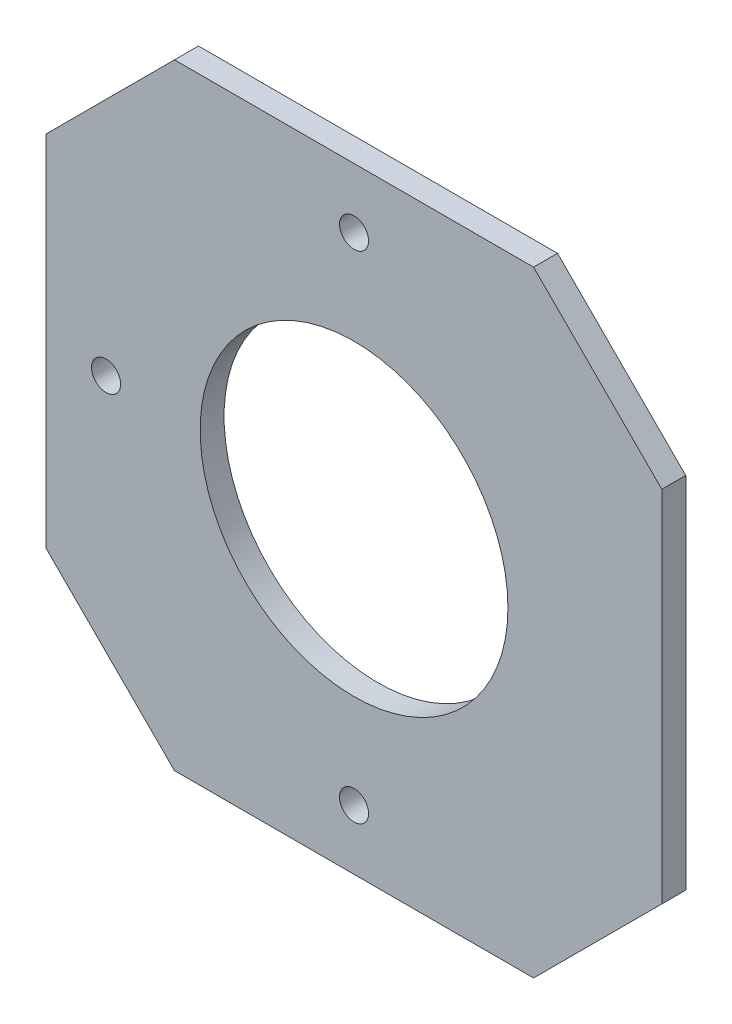
ISO-10303-21;
HEADER;
FILE_DESCRIPTION(('STEP AP214'),'2;1');
FILE_NAME('part.step','',(''),(''),'','','');
FILE_SCHEMA(('AUTOMOTIVE_DESIGN { 1 0 10303 214 1 1 1 1 }'));
ENDSEC;
DATA;
#1=APPLICATION_CONTEXT('core data for automotive mechanical design processes');
#2=APPLICATION_PROTOCOL_DEFINITION('international standard','automotive_design',2000,#1);
#3=PRODUCT_CONTEXT('',#1,'mechanical');
#4=PRODUCT('Part','Part','',(#3));
#5=PRODUCT_RELATED_PRODUCT_CATEGORY('part','',(#4));
#6=PRODUCT_DEFINITION_FORMATION('','',#4);
#7=PRODUCT_DEFINITION_CONTEXT('part definition',#1,'design');
#8=PRODUCT_DEFINITION('design','',#6,#7);
#9=PRODUCT_DEFINITION_SHAPE('','',#8);
#10=(LENGTH_UNIT() NAMED_UNIT(*) SI_UNIT(.MILLI.,.METRE.));
#11=(NAMED_UNIT(*) PLANE_ANGLE_UNIT() SI_UNIT($,.RADIAN.));
#12=(NAMED_UNIT(*) SI_UNIT($,.STERADIAN.) SOLID_ANGLE_UNIT());
#13=UNCERTAINTY_MEASURE_WITH_UNIT(LENGTH_MEASURE(1.E-05),#10,'distance_accuracy_value','');
#14=(GEOMETRIC_REPRESENTATION_CONTEXT(3) GLOBAL_UNCERTAINTY_ASSIGNED_CONTEXT((#13)) GLOBAL_UNIT_ASSIGNED_CONTEXT((#10,
#11,#12)) REPRESENTATION_CONTEXT('',''));
#15=CARTESIAN_POINT('',(0.,0.,0.));
#16=DIRECTION('',(0.,0.,1.));
#17=DIRECTION('',(1.,0.,0.));
#18=AXIS2_PLACEMENT_3D('',#15,#16,#17);
#19=CARTESIAN_POINT('',(0.,0.,2.8));
#20=DIRECTION('',(0.,0.,1.));
#21=DIRECTION('',(1.,0.,0.));
#22=AXIS2_PLACEMENT_3D('',#19,#20,#21);
#23=PLANE('',#22);
#24=CARTESIAN_POINT('',(0.,-29.,2.8));
#25=DIRECTION('',(0.,0.,1.));
#26=DIRECTION('',(1.,0.,0.));
#27=AXIS2_PLACEMENT_3D('',#24,#25,#26);
#28=CIRCLE('',#27,1.7);
#29=CARTESIAN_POINT('',(1.7,-29.,2.8));
#30=VERTEX_POINT('',#29);
#31=EDGE_CURVE('E196',#30,#30,#28,.T.);
#32=ORIENTED_EDGE('',*,*,#31,.F.);
#33=EDGE_LOOP('',(#32));
#34=FACE_BOUND('',#33,.T.);
#35=CARTESIAN_POINT('',(0.,0.,2.8));
#36=DIRECTION('',(0.,0.,1.));
#37=DIRECTION('',(1.,0.,0.));
#38=AXIS2_PLACEMENT_3D('',#35,#36,#37);
#39=CIRCLE('',#38,18.);
#40=CARTESIAN_POINT('',(18.,0.,2.8));
#41=VERTEX_POINT('',#40);
#42=EDGE_CURVE('E142',#41,#41,#39,.T.);
#43=ORIENTED_EDGE('',*,*,#42,.F.);
#44=EDGE_LOOP('',(#43));
#45=FACE_BOUND('',#44,.T.);
#46=DIRECTION('',(0.707106781186544,-0.707106781186551,0.));
#47=VECTOR('',#46,1.);
#48=CARTESIAN_POINT('',(-35.9999999999999,-21.,2.8));
#49=LINE('',#48,#47);
#50=CARTESIAN_POINT('',(-35.9999999999999,-21.,2.8));
#51=VERTEX_POINT('',#50);
#52=CARTESIAN_POINT('',(-21.,-36.,2.8));
#53=VERTEX_POINT('',#52);
#54=EDGE_CURVE('E153',#51,#53,#49,.T.);
#55=ORIENTED_EDGE('',*,*,#54,.T.);
#56=DIRECTION('',(1.,0.,0.));
#57=VECTOR('',#56,1.);
#58=CARTESIAN_POINT('',(-21.,-36.,2.8));
#59=LINE('',#58,#57);
#60=CARTESIAN_POINT('',(21.,-36.,2.8));
#61=VERTEX_POINT('',#60);
#62=EDGE_CURVE('E101',#53,#61,#59,.T.);
#63=ORIENTED_EDGE('',*,*,#62,.T.);
#64=DIRECTION('',(0.707106781186546,0.707106781186548,0.));
#65=VECTOR('',#64,1.);
#66=CARTESIAN_POINT('',(21.,-36.,2.8));
#67=LINE('',#66,#65);
#68=CARTESIAN_POINT('',(36.,-21.,2.8));
#69=VERTEX_POINT('',#68);
#70=EDGE_CURVE('E168',#61,#69,#67,.T.);
#71=ORIENTED_EDGE('',*,*,#70,.T.);
#72=DIRECTION('',(0.,1.,0.));
#73=VECTOR('',#72,1.);
#74=CARTESIAN_POINT('',(36.,-21.,2.8));
#75=LINE('',#74,#73);
#76=CARTESIAN_POINT('',(36.,21.,2.8));
#77=VERTEX_POINT('',#76);
#78=EDGE_CURVE('E181',#69,#77,#75,.T.);
#79=ORIENTED_EDGE('',*,*,#78,.T.);
#80=DIRECTION('',(-0.707106781186549,0.707106781186546,0.));
#81=VECTOR('',#80,1.);
#82=CARTESIAN_POINT('',(36.,21.,2.8));
#83=LINE('',#82,#81);
#84=CARTESIAN_POINT('',(21.,35.9999999999999,2.8));
#85=VERTEX_POINT('',#84);
#86=EDGE_CURVE('E120',#77,#85,#83,.T.);
#87=ORIENTED_EDGE('',*,*,#86,.T.);
#88=DIRECTION('',(-1.,0.,0.));
#89=VECTOR('',#88,1.);
#90=CARTESIAN_POINT('',(21.,35.9999999999999,2.8));
#91=LINE('',#90,#89);
#92=CARTESIAN_POINT('',(-21.,35.9999999999999,2.8));
#93=VERTEX_POINT('',#92);
#94=EDGE_CURVE('E114',#85,#93,#91,.T.);
#95=ORIENTED_EDGE('',*,*,#94,.T.);
#96=DIRECTION('',(-0.707106781186546,-0.707106781186549,0.));
#97=VECTOR('',#96,1.);
#98=CARTESIAN_POINT('',(-21.,35.9999999999999,2.8));
#99=LINE('',#98,#97);
#100=CARTESIAN_POINT('',(-35.9999999999999,21.,2.8));
#101=VERTEX_POINT('',#100);
#102=EDGE_CURVE('E118',#93,#101,#99,.T.);
#103=ORIENTED_EDGE('',*,*,#102,.T.);
#104=DIRECTION('',(0.,-1.,0.));
#105=VECTOR('',#104,1.);
#106=CARTESIAN_POINT('',(-35.9999999999999,21.,2.8));
#107=LINE('',#106,#105);
#108=EDGE_CURVE('E58',#101,#51,#107,.T.);
#109=ORIENTED_EDGE('',*,*,#108,.T.);
#110=EDGE_LOOP('',(#55,#63,#71,#79,#87,#95,#103,#109));
#111=FACE_BOUND('',#110,.T.);
#112=CARTESIAN_POINT('',(0.,29.,2.8));
#113=DIRECTION('',(0.,0.,1.));
#114=DIRECTION('',(1.,0.,0.));
#115=AXIS2_PLACEMENT_3D('',#112,#113,#114);
#116=CIRCLE('',#115,1.7);
#117=CARTESIAN_POINT('',(1.7,29.,2.8));
#118=VERTEX_POINT('',#117);
#119=EDGE_CURVE('E190',#118,#118,#116,.T.);
#120=ORIENTED_EDGE('',*,*,#119,.F.);
#121=EDGE_LOOP('',(#120));
#122=FACE_BOUND('',#121,.T.);
#123=CARTESIAN_POINT('',(-29.,0.,2.8));
#124=DIRECTION('',(0.,0.,1.));
#125=DIRECTION('',(1.,0.,0.));
#126=AXIS2_PLACEMENT_3D('',#123,#124,#125);
#127=CIRCLE('',#126,1.7);
#128=CARTESIAN_POINT('',(-27.3,0.,2.8));
#129=VERTEX_POINT('',#128);
#130=EDGE_CURVE('E202',#129,#129,#127,.T.);
#131=ORIENTED_EDGE('',*,*,#130,.F.);
#132=EDGE_LOOP('',(#131));
#133=FACE_BOUND('',#132,.T.);
#134=ADVANCED_FACE('F41',(#34,#45,#111,#122,#133),#23,.T.);
#135=CARTESIAN_POINT('',(0.,0.,0.));
#136=DIRECTION('',(0.,0.,1.));
#137=DIRECTION('',(1.,0.,0.));
#138=AXIS2_PLACEMENT_3D('',#135,#136,#137);
#139=PLANE('',#138);
#140=DIRECTION('',(0.707106781186544,-0.707106781186551,0.));
#141=VECTOR('',#140,1.);
#142=CARTESIAN_POINT('',(-35.9999999999999,-21.,0.));
#143=LINE('',#142,#141);
#144=CARTESIAN_POINT('',(-35.9999999999999,-21.,0.));
#145=VERTEX_POINT('',#144);
#146=CARTESIAN_POINT('',(-21.,-36.,0.));
#147=VERTEX_POINT('',#146);
#148=EDGE_CURVE('E138',#145,#147,#143,.T.);
#149=ORIENTED_EDGE('',*,*,#148,.F.);
#150=DIRECTION('',(0.,-1.,0.));
#151=VECTOR('',#150,1.);
#152=CARTESIAN_POINT('',(-35.9999999999999,21.,0.));
#153=LINE('',#152,#151);
#154=CARTESIAN_POINT('',(-35.9999999999999,21.,0.));
#155=VERTEX_POINT('',#154);
#156=EDGE_CURVE('E93',#155,#145,#153,.T.);
#157=ORIENTED_EDGE('',*,*,#156,.F.);
#158=DIRECTION('',(-0.707106781186546,-0.707106781186549,0.));
#159=VECTOR('',#158,1.);
#160=CARTESIAN_POINT('',(-21.,35.9999999999999,0.));
#161=LINE('',#160,#159);
#162=CARTESIAN_POINT('',(-21.,35.9999999999999,0.));
#163=VERTEX_POINT('',#162);
#164=EDGE_CURVE('E87',#163,#155,#161,.T.);
#165=ORIENTED_EDGE('',*,*,#164,.F.);
#166=DIRECTION('',(-1.,0.,0.));
#167=VECTOR('',#166,1.);
#168=CARTESIAN_POINT('',(21.,35.9999999999999,0.));
#169=LINE('',#168,#167);
#170=CARTESIAN_POINT('',(21.,35.9999999999999,0.));
#171=VERTEX_POINT('',#170);
#172=EDGE_CURVE('E128',#171,#163,#169,.T.);
#173=ORIENTED_EDGE('',*,*,#172,.F.);
#174=DIRECTION('',(-0.707106781186549,0.707106781186546,0.));
#175=VECTOR('',#174,1.);
#176=CARTESIAN_POINT('',(36.,21.,0.));
#177=LINE('',#176,#175);
#178=CARTESIAN_POINT('',(36.,21.,0.));
#179=VERTEX_POINT('',#178);
#180=EDGE_CURVE('E148',#179,#171,#177,.T.);
#181=ORIENTED_EDGE('',*,*,#180,.F.);
#182=DIRECTION('',(0.,1.,0.));
#183=VECTOR('',#182,1.);
#184=CARTESIAN_POINT('',(36.,-21.,0.));
#185=LINE('',#184,#183);
#186=CARTESIAN_POINT('',(36.,-21.,0.));
#187=VERTEX_POINT('',#186);
#188=EDGE_CURVE('E146',#187,#179,#185,.T.);
#189=ORIENTED_EDGE('',*,*,#188,.F.);
#190=DIRECTION('',(0.707106781186546,0.707106781186548,0.));
#191=VECTOR('',#190,1.);
#192=CARTESIAN_POINT('',(21.,-36.,0.));
#193=LINE('',#192,#191);
#194=CARTESIAN_POINT('',(21.,-36.,0.));
#195=VERTEX_POINT('',#194);
#196=EDGE_CURVE('E144',#195,#187,#193,.T.);
#197=ORIENTED_EDGE('',*,*,#196,.F.);
#198=DIRECTION('',(1.,0.,0.));
#199=VECTOR('',#198,1.);
#200=CARTESIAN_POINT('',(-21.,-36.,0.));
#201=LINE('',#200,#199);
#202=EDGE_CURVE('E141',#147,#195,#201,.T.);
#203=ORIENTED_EDGE('',*,*,#202,.F.);
#204=EDGE_LOOP('',(#149,#157,#165,#173,#181,#189,#197,#203));
#205=FACE_BOUND('',#204,.T.);
#206=CARTESIAN_POINT('',(0.,0.,0.));
#207=DIRECTION('',(0.,0.,1.));
#208=DIRECTION('',(1.,0.,0.));
#209=AXIS2_PLACEMENT_3D('',#206,#207,#208);
#210=CIRCLE('',#209,18.);
#211=CARTESIAN_POINT('',(18.,0.,0.));
#212=VERTEX_POINT('',#211);
#213=EDGE_CURVE('E187',#212,#212,#210,.T.);
#214=ORIENTED_EDGE('',*,*,#213,.T.);
#215=EDGE_LOOP('',(#214));
#216=FACE_BOUND('',#215,.T.);
#217=CARTESIAN_POINT('',(0.,29.,0.));
#218=DIRECTION('',(0.,0.,1.));
#219=DIRECTION('',(1.,0.,0.));
#220=AXIS2_PLACEMENT_3D('',#217,#218,#219);
#221=CIRCLE('',#220,1.7);
#222=CARTESIAN_POINT('',(1.7,29.,0.));
#223=VERTEX_POINT('',#222);
#224=EDGE_CURVE('E193',#223,#223,#221,.T.);
#225=ORIENTED_EDGE('',*,*,#224,.T.);
#226=EDGE_LOOP('',(#225));
#227=FACE_BOUND('',#226,.T.);
#228=CARTESIAN_POINT('',(0.,-29.,0.));
#229=DIRECTION('',(0.,0.,1.));
#230=DIRECTION('',(1.,0.,0.));
#231=AXIS2_PLACEMENT_3D('',#228,#229,#230);
#232=CIRCLE('',#231,1.7);
#233=CARTESIAN_POINT('',(1.7,-29.,0.));
#234=VERTEX_POINT('',#233);
#235=EDGE_CURVE('E199',#234,#234,#232,.T.);
#236=ORIENTED_EDGE('',*,*,#235,.T.);
#237=EDGE_LOOP('',(#236));
#238=FACE_BOUND('',#237,.T.);
#239=CARTESIAN_POINT('',(-29.,0.,0.));
#240=DIRECTION('',(0.,0.,1.));
#241=DIRECTION('',(1.,0.,0.));
#242=AXIS2_PLACEMENT_3D('',#239,#240,#241);
#243=CIRCLE('',#242,1.7);
#244=CARTESIAN_POINT('',(-27.3,0.,0.));
#245=VERTEX_POINT('',#244);
#246=EDGE_CURVE('E205',#245,#245,#243,.T.);
#247=ORIENTED_EDGE('',*,*,#246,.T.);
#248=EDGE_LOOP('',(#247));
#249=FACE_BOUND('',#248,.T.);
#250=ADVANCED_FACE('F172',(#205,#216,#227,#238,#249),#139,.F.);
#251=CARTESIAN_POINT('',(-35.9999999999999,-21.,2.8));
#252=DIRECTION('',(0.707106781186551,0.707106781186544,0.));
#253=DIRECTION('',(-0.707106781186544,0.707106781186551,0.));
#254=AXIS2_PLACEMENT_3D('',#251,#252,#253);
#255=PLANE('',#254);
#256=ORIENTED_EDGE('',*,*,#148,.T.);
#257=DIRECTION('',(0.,0.,-1.));
#258=VECTOR('',#257,1.);
#259=CARTESIAN_POINT('',(-21.,-36.,2.8));
#260=LINE('',#259,#258);
#261=EDGE_CURVE('E11',#53,#147,#260,.T.);
#262=ORIENTED_EDGE('',*,*,#261,.F.);
#263=ORIENTED_EDGE('',*,*,#54,.F.);
#264=DIRECTION('',(0.,0.,-1.));
#265=VECTOR('',#264,1.);
#266=CARTESIAN_POINT('',(-35.9999999999999,-21.,2.8));
#267=LINE('',#266,#265);
#268=EDGE_CURVE('E134',#51,#145,#267,.T.);
#269=ORIENTED_EDGE('',*,*,#268,.T.);
#270=EDGE_LOOP('',(#256,#262,#263,#269));
#271=FACE_BOUND('',#270,.T.);
#272=ADVANCED_FACE('F43',(#271),#255,.F.);
#273=CARTESIAN_POINT('',(-21.,-36.,2.8));
#274=DIRECTION('',(0.,1.,0.));
#275=DIRECTION('',(0.,0.,1.));
#276=AXIS2_PLACEMENT_3D('',#273,#274,#275);
#277=PLANE('',#276);
#278=ORIENTED_EDGE('',*,*,#202,.T.);
#279=DIRECTION('',(0.,0.,-1.));
#280=VECTOR('',#279,1.);
#281=CARTESIAN_POINT('',(21.,-36.,2.8));
#282=LINE('',#281,#280);
#283=EDGE_CURVE('E50',#61,#195,#282,.T.);
#284=ORIENTED_EDGE('',*,*,#283,.F.);
#285=ORIENTED_EDGE('',*,*,#62,.F.);
#286=ORIENTED_EDGE('',*,*,#261,.T.);
#287=EDGE_LOOP('',(#278,#284,#285,#286));
#288=FACE_BOUND('',#287,.T.);
#289=ADVANCED_FACE('F239',(#288),#277,.F.);
#290=CARTESIAN_POINT('',(21.,-36.,2.8));
#291=DIRECTION('',(-0.707106781186549,0.707106781186546,0.));
#292=DIRECTION('',(-0.707106781186546,-0.707106781186549,0.));
#293=AXIS2_PLACEMENT_3D('',#290,#291,#292);
#294=PLANE('',#293);
#295=ORIENTED_EDGE('',*,*,#196,.T.);
#296=DIRECTION('',(0.,0.,-1.));
#297=VECTOR('',#296,1.);
#298=CARTESIAN_POINT('',(36.,-21.,2.8));
#299=LINE('',#298,#297);
#300=EDGE_CURVE('E160',#69,#187,#299,.T.);
#301=ORIENTED_EDGE('',*,*,#300,.F.);
#302=ORIENTED_EDGE('',*,*,#70,.F.);
#303=ORIENTED_EDGE('',*,*,#283,.T.);
#304=EDGE_LOOP('',(#295,#301,#302,#303));
#305=FACE_BOUND('',#304,.T.);
#306=ADVANCED_FACE('F166',(#305),#294,.F.);
#307=CARTESIAN_POINT('',(36.,-21.,2.8));
#308=DIRECTION('',(-1.,0.,0.));
#309=DIRECTION('',(0.,0.,1.));
#310=AXIS2_PLACEMENT_3D('',#307,#308,#309);
#311=PLANE('',#310);
#312=ORIENTED_EDGE('',*,*,#188,.T.);
#313=DIRECTION('',(0.,0.,-1.));
#314=VECTOR('',#313,1.);
#315=CARTESIAN_POINT('',(36.,21.,2.8));
#316=LINE('',#315,#314);
#317=EDGE_CURVE('E157',#77,#179,#316,.T.);
#318=ORIENTED_EDGE('',*,*,#317,.F.);
#319=ORIENTED_EDGE('',*,*,#78,.F.);
#320=ORIENTED_EDGE('',*,*,#300,.T.);
#321=EDGE_LOOP('',(#312,#318,#319,#320));
#322=FACE_BOUND('',#321,.T.);
#323=ADVANCED_FACE('F177',(#322),#311,.F.);
#324=CARTESIAN_POINT('',(36.,21.,2.8));
#325=DIRECTION('',(-0.707106781186546,-0.707106781186549,0.));
#326=DIRECTION('',(0.707106781186549,-0.707106781186546,0.));
#327=AXIS2_PLACEMENT_3D('',#324,#325,#326);
#328=PLANE('',#327);
#329=ORIENTED_EDGE('',*,*,#180,.T.);
#330=DIRECTION('',(0.,0.,-1.));
#331=VECTOR('',#330,1.);
#332=CARTESIAN_POINT('',(21.,35.9999999999999,2.8));
#333=LINE('',#332,#331);
#334=EDGE_CURVE('E129',#85,#171,#333,.T.);
#335=ORIENTED_EDGE('',*,*,#334,.F.);
#336=ORIENTED_EDGE('',*,*,#86,.F.);
#337=ORIENTED_EDGE('',*,*,#317,.T.);
#338=EDGE_LOOP('',(#329,#335,#336,#337));
#339=FACE_BOUND('',#338,.T.);
#340=ADVANCED_FACE('F180',(#339),#328,.F.);
#341=CARTESIAN_POINT('',(21.,35.9999999999999,2.8));
#342=DIRECTION('',(0.,-1.,0.));
#343=DIRECTION('',(0.,0.,-1.));
#344=AXIS2_PLACEMENT_3D('',#341,#342,#343);
#345=PLANE('',#344);
#346=ORIENTED_EDGE('',*,*,#172,.T.);
#347=DIRECTION('',(0.,0.,-1.));
#348=VECTOR('',#347,1.);
#349=CARTESIAN_POINT('',(-21.,35.9999999999999,2.8));
#350=LINE('',#349,#348);
#351=EDGE_CURVE('E125',#93,#163,#350,.T.);
#352=ORIENTED_EDGE('',*,*,#351,.F.);
#353=ORIENTED_EDGE('',*,*,#94,.F.);
#354=ORIENTED_EDGE('',*,*,#334,.T.);
#355=EDGE_LOOP('',(#346,#352,#353,#354));
#356=FACE_BOUND('',#355,.T.);
#357=ADVANCED_FACE('F126',(#356),#345,.F.);
#358=CARTESIAN_POINT('',(-21.,35.9999999999999,2.8));
#359=DIRECTION('',(0.707106781186549,-0.707106781186546,0.));
#360=DIRECTION('',(0.707106781186546,0.707106781186549,0.));
#361=AXIS2_PLACEMENT_3D('',#358,#359,#360);
#362=PLANE('',#361);
#363=ORIENTED_EDGE('',*,*,#164,.T.);
#364=DIRECTION('',(0.,0.,-1.));
#365=VECTOR('',#364,1.);
#366=CARTESIAN_POINT('',(-35.9999999999999,21.,2.8));
#367=LINE('',#366,#365);
#368=EDGE_CURVE('E130',#101,#155,#367,.T.);
#369=ORIENTED_EDGE('',*,*,#368,.F.);
#370=ORIENTED_EDGE('',*,*,#102,.F.);
#371=ORIENTED_EDGE('',*,*,#351,.T.);
#372=EDGE_LOOP('',(#363,#369,#370,#371));
#373=FACE_BOUND('',#372,.T.);
#374=ADVANCED_FACE('F132',(#373),#362,.F.);
#375=CARTESIAN_POINT('',(-35.9999999999999,21.,2.8));
#376=DIRECTION('',(1.,0.,0.));
#377=DIRECTION('',(0.,0.,-1.));
#378=AXIS2_PLACEMENT_3D('',#375,#376,#377);
#379=PLANE('',#378);
#380=ORIENTED_EDGE('',*,*,#156,.T.);
#381=ORIENTED_EDGE('',*,*,#268,.F.);
#382=ORIENTED_EDGE('',*,*,#108,.F.);
#383=ORIENTED_EDGE('',*,*,#368,.T.);
#384=EDGE_LOOP('',(#380,#381,#382,#383));
#385=FACE_BOUND('',#384,.T.);
#386=ADVANCED_FACE('F227',(#385),#379,.F.);
#387=CARTESIAN_POINT('',(0.,0.,2.8));
#388=DIRECTION('',(0.,0.,-1.));
#389=DIRECTION('',(-1.,0.,0.));
#390=AXIS2_PLACEMENT_3D('',#387,#388,#389);
#391=CYLINDRICAL_SURFACE('',#390,18.);
#392=ORIENTED_EDGE('',*,*,#42,.T.);
#393=EDGE_LOOP('',(#392));
#394=FACE_BOUND('',#393,.T.);
#395=ORIENTED_EDGE('',*,*,#213,.F.);
#396=EDGE_LOOP('',(#395));
#397=FACE_BOUND('',#396,.T.);
#398=ADVANCED_FACE('F224',(#394,#397),#391,.F.);
#399=CARTESIAN_POINT('',(0.,29.,2.8));
#400=DIRECTION('',(0.,0.,-1.));
#401=DIRECTION('',(-1.,0.,0.));
#402=AXIS2_PLACEMENT_3D('',#399,#400,#401);
#403=CYLINDRICAL_SURFACE('',#402,1.7);
#404=ORIENTED_EDGE('',*,*,#119,.T.);
#405=EDGE_LOOP('',(#404));
#406=FACE_BOUND('',#405,.T.);
#407=ORIENTED_EDGE('',*,*,#224,.F.);
#408=EDGE_LOOP('',(#407));
#409=FACE_BOUND('',#408,.T.);
#410=ADVANCED_FACE('F302',(#406,#409),#403,.F.);
#411=CARTESIAN_POINT('',(0.,-29.,2.8));
#412=DIRECTION('',(0.,0.,-1.));
#413=DIRECTION('',(-1.,0.,0.));
#414=AXIS2_PLACEMENT_3D('',#411,#412,#413);
#415=CYLINDRICAL_SURFACE('',#414,1.7);
#416=ORIENTED_EDGE('',*,*,#31,.T.);
#417=EDGE_LOOP('',(#416));
#418=FACE_BOUND('',#417,.T.);
#419=ORIENTED_EDGE('',*,*,#235,.F.);
#420=EDGE_LOOP('',(#419));
#421=FACE_BOUND('',#420,.T.);
#422=ADVANCED_FACE('F310',(#418,#421),#415,.F.);
#423=CARTESIAN_POINT('',(-29.,0.,2.8));
#424=DIRECTION('',(0.,0.,-1.));
#425=DIRECTION('',(-1.,0.,0.));
#426=AXIS2_PLACEMENT_3D('',#423,#424,#425);
#427=CYLINDRICAL_SURFACE('',#426,1.7);
#428=ORIENTED_EDGE('',*,*,#130,.T.);
#429=EDGE_LOOP('',(#428));
#430=FACE_BOUND('',#429,.T.);
#431=ORIENTED_EDGE('',*,*,#246,.F.);
#432=EDGE_LOOP('',(#431));
#433=FACE_BOUND('',#432,.T.);
#434=ADVANCED_FACE('F211',(#430,#433),#427,.F.);
#435=CLOSED_SHELL('',(#134,#250,#272,#289,#306,#323,#340,#357,#374,#386,#398,#410,#422,#434));
#436=MANIFOLD_SOLID_BREP('B2',#435);
#437=ADVANCED_BREP_SHAPE_REPRESENTATION('',(#18,#436),#14);
#438=SHAPE_DEFINITION_REPRESENTATION(#9,#437);
ENDSEC;
END-ISO-10303-21;
